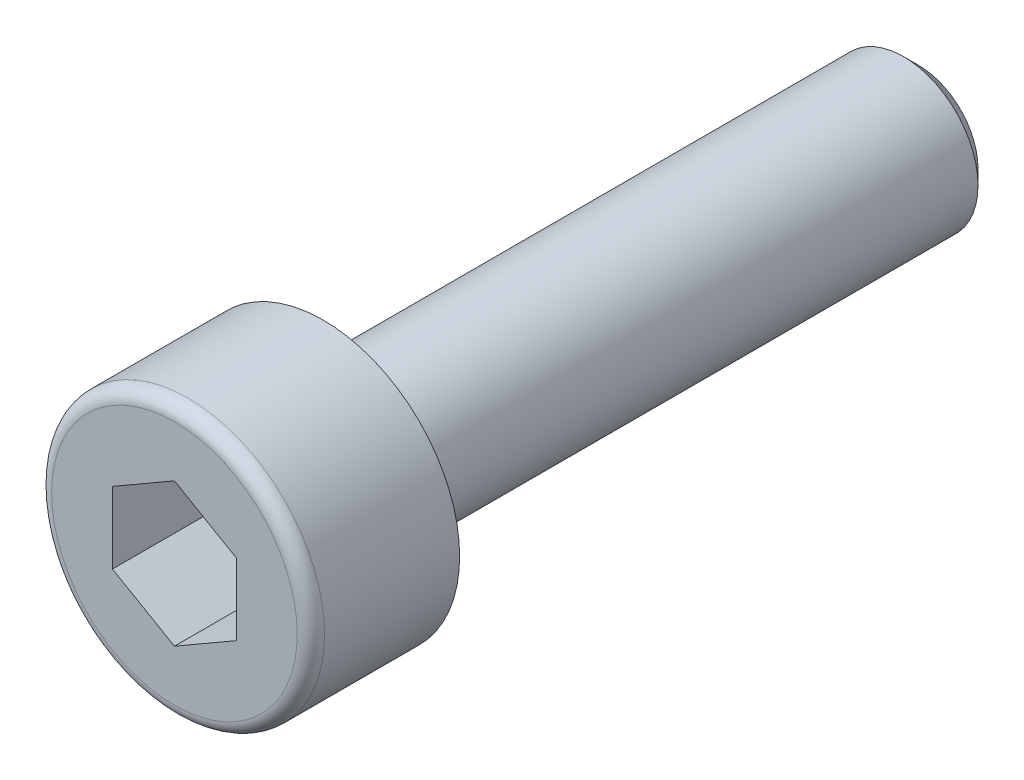
ISO-10303-21;
HEADER;
FILE_DESCRIPTION(('STEP AP214'),'2;1');
FILE_NAME('part.step','',(''),(''),'','','');
FILE_SCHEMA(('AUTOMOTIVE_DESIGN { 1 0 10303 214 1 1 1 1 }'));
ENDSEC;
DATA;
#1=APPLICATION_CONTEXT('core data for automotive mechanical design processes');
#2=APPLICATION_PROTOCOL_DEFINITION('international standard','automotive_design',2000,#1);
#3=PRODUCT_CONTEXT('',#1,'mechanical');
#4=PRODUCT('Part','Part','',(#3));
#5=PRODUCT_RELATED_PRODUCT_CATEGORY('part','',(#4));
#6=PRODUCT_DEFINITION_FORMATION('','',#4);
#7=PRODUCT_DEFINITION_CONTEXT('part definition',#1,'design');
#8=PRODUCT_DEFINITION('design','',#6,#7);
#9=PRODUCT_DEFINITION_SHAPE('','',#8);
#10=(LENGTH_UNIT() NAMED_UNIT(*) SI_UNIT(.MILLI.,.METRE.));
#11=(NAMED_UNIT(*) PLANE_ANGLE_UNIT() SI_UNIT($,.RADIAN.));
#12=(NAMED_UNIT(*) SI_UNIT($,.STERADIAN.) SOLID_ANGLE_UNIT());
#13=UNCERTAINTY_MEASURE_WITH_UNIT(LENGTH_MEASURE(1.E-05),#10,'distance_accuracy_value','');
#14=(GEOMETRIC_REPRESENTATION_CONTEXT(3) GLOBAL_UNCERTAINTY_ASSIGNED_CONTEXT((#13)) GLOBAL_UNIT_ASSIGNED_CONTEXT((#10,
#11,#12)) REPRESENTATION_CONTEXT('',''));
#15=CARTESIAN_POINT('',(0.,0.,0.));
#16=DIRECTION('',(0.,0.,1.));
#17=DIRECTION('',(1.,0.,0.));
#18=AXIS2_PLACEMENT_3D('',#15,#16,#17);
#19=CARTESIAN_POINT('',(0.,0.,3.));
#20=DIRECTION('',(0.,0.,-1.));
#21=DIRECTION('',(-1.,0.,0.));
#22=AXIS2_PLACEMENT_3D('',#19,#20,#21);
#23=PLANE('',#22);
#24=CARTESIAN_POINT('',(0.,0.,3.));
#25=DIRECTION('',(0.,0.,-1.));
#26=DIRECTION('',(-1.,0.,0.));
#27=AXIS2_PLACEMENT_3D('',#24,#25,#26);
#28=CIRCLE('',#27,2.475);
#29=CARTESIAN_POINT('',(-2.475,0.,3.));
#30=VERTEX_POINT('',#29);
#31=EDGE_CURVE('E177',#30,#30,#28,.F.);
#32=ORIENTED_EDGE('',*,*,#31,.T.);
#33=EDGE_LOOP('',(#32));
#34=FACE_BOUND('',#33,.T.);
#35=DIRECTION('',(-0.866025403784439,-0.5,0.));
#36=VECTOR('',#35,1.);
#37=CARTESIAN_POINT('',(0.,1.44337567297406,3.));
#38=LINE('',#37,#36);
#39=CARTESIAN_POINT('',(0.,1.44337567297406,3.));
#40=VERTEX_POINT('',#39);
#41=CARTESIAN_POINT('',(-1.25,0.721687836487032,3.));
#42=VERTEX_POINT('',#41);
#43=EDGE_CURVE('E141',#40,#42,#38,.T.);
#44=ORIENTED_EDGE('',*,*,#43,.F.);
#45=DIRECTION('',(-0.866025403784439,0.5,0.));
#46=VECTOR('',#45,1.);
#47=CARTESIAN_POINT('',(1.25,0.721687836487032,3.));
#48=LINE('',#47,#46);
#49=CARTESIAN_POINT('',(1.25,0.721687836487032,3.));
#50=VERTEX_POINT('',#49);
#51=EDGE_CURVE('E61',#50,#40,#48,.T.);
#52=ORIENTED_EDGE('',*,*,#51,.F.);
#53=DIRECTION('',(0.,1.,0.));
#54=VECTOR('',#53,1.);
#55=CARTESIAN_POINT('',(1.25,-0.721687836487032,3.));
#56=LINE('',#55,#54);
#57=CARTESIAN_POINT('',(1.25,-0.721687836487032,3.));
#58=VERTEX_POINT('',#57);
#59=EDGE_CURVE('E154',#58,#50,#56,.T.);
#60=ORIENTED_EDGE('',*,*,#59,.F.);
#61=DIRECTION('',(0.866025403784439,0.5,0.));
#62=VECTOR('',#61,1.);
#63=CARTESIAN_POINT('',(0.,-1.44337567297406,3.));
#64=LINE('',#63,#62);
#65=CARTESIAN_POINT('',(0.,-1.44337567297406,3.));
#66=VERTEX_POINT('',#65);
#67=EDGE_CURVE('E151',#66,#58,#64,.T.);
#68=ORIENTED_EDGE('',*,*,#67,.F.);
#69=DIRECTION('',(0.866025403784439,-0.5,0.));
#70=VECTOR('',#69,1.);
#71=CARTESIAN_POINT('',(-1.25,-0.721687836487033,3.));
#72=LINE('',#71,#70);
#73=CARTESIAN_POINT('',(-1.25,-0.721687836487033,3.));
#74=VERTEX_POINT('',#73);
#75=EDGE_CURVE('E109',#74,#66,#72,.T.);
#76=ORIENTED_EDGE('',*,*,#75,.F.);
#77=DIRECTION('',(0.,-1.,0.));
#78=VECTOR('',#77,1.);
#79=CARTESIAN_POINT('',(-1.25,0.721687836487032,3.));
#80=LINE('',#79,#78);
#81=EDGE_CURVE('E145',#42,#74,#80,.T.);
#82=ORIENTED_EDGE('',*,*,#81,.F.);
#83=EDGE_LOOP('',(#44,#52,#60,#68,#76,#82));
#84=FACE_BOUND('',#83,.T.);
#85=ADVANCED_FACE('F45',(#34,#84),#23,.F.);
#86=CARTESIAN_POINT('',(0.,0.,3.));
#87=DIRECTION('',(0.,0.,1.));
#88=DIRECTION('',(1.,0.,0.));
#89=AXIS2_PLACEMENT_3D('',#86,#87,#88);
#90=CYLINDRICAL_SURFACE('',#89,2.75);
#91=CARTESIAN_POINT('',(0.,0.,2.725));
#92=DIRECTION('',(0.,0.,-1.));
#93=DIRECTION('',(-1.,0.,0.));
#94=AXIS2_PLACEMENT_3D('',#91,#92,#93);
#95=CIRCLE('',#94,2.75);
#96=CARTESIAN_POINT('',(-2.75,0.,2.725));
#97=VERTEX_POINT('',#96);
#98=EDGE_CURVE('E181',#97,#97,#95,.T.);
#99=ORIENTED_EDGE('',*,*,#98,.T.);
#100=EDGE_LOOP('',(#99));
#101=FACE_BOUND('',#100,.T.);
#102=CARTESIAN_POINT('',(0.,0.,0.));
#103=DIRECTION('',(0.,0.,1.));
#104=DIRECTION('',(1.,0.,0.));
#105=AXIS2_PLACEMENT_3D('',#102,#103,#104);
#106=CIRCLE('',#105,2.75);
#107=CARTESIAN_POINT('',(2.75,0.,0.));
#108=VERTEX_POINT('',#107);
#109=EDGE_CURVE('E173',#108,#108,#106,.T.);
#110=ORIENTED_EDGE('',*,*,#109,.T.);
#111=EDGE_LOOP('',(#110));
#112=FACE_BOUND('',#111,.T.);
#113=ADVANCED_FACE('F201',(#101,#112),#90,.T.);
#114=CARTESIAN_POINT('',(0.,2.75,0.));
#115=DIRECTION('',(0.,0.,1.));
#116=DIRECTION('',(1.,0.,0.));
#117=AXIS2_PLACEMENT_3D('',#114,#115,#116);
#118=PLANE('',#117);
#119=ORIENTED_EDGE('',*,*,#109,.F.);
#120=EDGE_LOOP('',(#119));
#121=FACE_BOUND('',#120,.T.);
#122=CARTESIAN_POINT('',(0.,0.,0.));
#123=DIRECTION('',(0.,0.,1.));
#124=DIRECTION('',(1.,0.,0.));
#125=AXIS2_PLACEMENT_3D('',#122,#123,#124);
#126=CIRCLE('',#125,1.5);
#127=CARTESIAN_POINT('',(1.5,0.,0.));
#128=VERTEX_POINT('',#127);
#129=EDGE_CURVE('E160',#128,#128,#126,.T.);
#130=ORIENTED_EDGE('',*,*,#129,.T.);
#131=EDGE_LOOP('',(#130));
#132=FACE_BOUND('',#131,.T.);
#133=ADVANCED_FACE('F208',(#121,#132),#118,.F.);
#134=CARTESIAN_POINT('',(0.,0.,3.));
#135=DIRECTION('',(0.,0.,1.));
#136=DIRECTION('',(1.,0.,0.));
#137=AXIS2_PLACEMENT_3D('',#134,#135,#136);
#138=CYLINDRICAL_SURFACE('',#137,1.5);
#139=CARTESIAN_POINT('',(0.,0.,-11.7));
#140=DIRECTION('',(0.,0.,1.));
#141=DIRECTION('',(1.,0.,0.));
#142=AXIS2_PLACEMENT_3D('',#139,#140,#141);
#143=CIRCLE('',#142,1.5);
#144=CARTESIAN_POINT('',(1.5,0.,-11.7));
#145=VERTEX_POINT('',#144);
#146=EDGE_CURVE('E54',#145,#145,#143,.T.);
#147=ORIENTED_EDGE('',*,*,#146,.T.);
#148=EDGE_LOOP('',(#147));
#149=FACE_BOUND('',#148,.T.);
#150=ORIENTED_EDGE('',*,*,#129,.F.);
#151=EDGE_LOOP('',(#150));
#152=FACE_BOUND('',#151,.T.);
#153=ADVANCED_FACE('F188',(#149,#152),#138,.T.);
#154=CARTESIAN_POINT('',(0.,1.5,-12.));
#155=DIRECTION('',(0.,0.,1.));
#156=DIRECTION('',(1.,0.,0.));
#157=AXIS2_PLACEMENT_3D('',#154,#155,#156);
#158=PLANE('',#157);
#159=CARTESIAN_POINT('',(0.,0.,-12.));
#160=DIRECTION('',(0.,0.,1.));
#161=DIRECTION('',(1.,0.,0.));
#162=AXIS2_PLACEMENT_3D('',#159,#160,#161);
#163=CIRCLE('',#162,1.2);
#164=CARTESIAN_POINT('',(1.2,0.,-12.));
#165=VERTEX_POINT('',#164);
#166=EDGE_CURVE('E11',#165,#165,#163,.F.);
#167=ORIENTED_EDGE('',*,*,#166,.T.);
#168=EDGE_LOOP('',(#167));
#169=FACE_BOUND('',#168,.T.);
#170=ADVANCED_FACE('F218',(#169),#158,.F.);
#171=CARTESIAN_POINT('',(1.25,0.721687836487032,1.075));
#172=DIRECTION('',(0.5,0.866025403784439,0.));
#173=DIRECTION('',(-0.866025403784439,0.5,0.));
#174=AXIS2_PLACEMENT_3D('',#171,#172,#173);
#175=PLANE('',#174);
#176=ORIENTED_EDGE('',*,*,#51,.T.);
#177=DIRECTION('',(0.,0.,1.));
#178=VECTOR('',#177,1.);
#179=CARTESIAN_POINT('',(0.,1.44337567297406,1.075));
#180=LINE('',#179,#178);
#181=CARTESIAN_POINT('',(0.,1.44337567297406,1.075));
#182=VERTEX_POINT('',#181);
#183=EDGE_CURVE('E91',#182,#40,#180,.T.);
#184=ORIENTED_EDGE('',*,*,#183,.F.);
#185=DIRECTION('',(-0.866025403784439,0.5,0.));
#186=VECTOR('',#185,1.);
#187=CARTESIAN_POINT('',(1.25,0.721687836487032,1.075));
#188=LINE('',#187,#186);
#189=CARTESIAN_POINT('',(1.25,0.721687836487032,1.075));
#190=VERTEX_POINT('',#189);
#191=EDGE_CURVE('E157',#190,#182,#188,.T.);
#192=ORIENTED_EDGE('',*,*,#191,.F.);
#193=DIRECTION('',(0.,0.,1.));
#194=VECTOR('',#193,1.);
#195=CARTESIAN_POINT('',(1.25,0.721687836487032,1.075));
#196=LINE('',#195,#194);
#197=EDGE_CURVE('E69',#190,#50,#196,.T.);
#198=ORIENTED_EDGE('',*,*,#197,.T.);
#199=EDGE_LOOP('',(#176,#184,#192,#198));
#200=FACE_BOUND('',#199,.T.);
#201=ADVANCED_FACE('F220',(#200),#175,.F.);
#202=CARTESIAN_POINT('',(1.25,-0.721687836487032,1.075));
#203=DIRECTION('',(1.,0.,0.));
#204=DIRECTION('',(0.,0.,-1.));
#205=AXIS2_PLACEMENT_3D('',#202,#203,#204);
#206=PLANE('',#205);
#207=ORIENTED_EDGE('',*,*,#59,.T.);
#208=ORIENTED_EDGE('',*,*,#197,.F.);
#209=DIRECTION('',(0.,1.,0.));
#210=VECTOR('',#209,1.);
#211=CARTESIAN_POINT('',(1.25,-0.721687836487032,1.075));
#212=LINE('',#211,#210);
#213=CARTESIAN_POINT('',(1.25,-0.721687836487032,1.075));
#214=VERTEX_POINT('',#213);
#215=EDGE_CURVE('E123',#214,#190,#212,.T.);
#216=ORIENTED_EDGE('',*,*,#215,.F.);
#217=DIRECTION('',(0.,0.,1.));
#218=VECTOR('',#217,1.);
#219=CARTESIAN_POINT('',(1.25,-0.721687836487032,1.075));
#220=LINE('',#219,#218);
#221=EDGE_CURVE('E114',#214,#58,#220,.T.);
#222=ORIENTED_EDGE('',*,*,#221,.T.);
#223=EDGE_LOOP('',(#207,#208,#216,#222));
#224=FACE_BOUND('',#223,.T.);
#225=ADVANCED_FACE('F224',(#224),#206,.F.);
#226=CARTESIAN_POINT('',(0.,-1.44337567297406,1.075));
#227=DIRECTION('',(0.5,-0.866025403784439,0.));
#228=DIRECTION('',(0.866025403784439,0.5,0.));
#229=AXIS2_PLACEMENT_3D('',#226,#227,#228);
#230=PLANE('',#229);
#231=ORIENTED_EDGE('',*,*,#67,.T.);
#232=ORIENTED_EDGE('',*,*,#221,.F.);
#233=DIRECTION('',(0.866025403784439,0.5,0.));
#234=VECTOR('',#233,1.);
#235=CARTESIAN_POINT('',(0.,-1.44337567297406,1.075));
#236=LINE('',#235,#234);
#237=CARTESIAN_POINT('',(0.,-1.44337567297406,1.075));
#238=VERTEX_POINT('',#237);
#239=EDGE_CURVE('E118',#238,#214,#236,.T.);
#240=ORIENTED_EDGE('',*,*,#239,.F.);
#241=DIRECTION('',(0.,0.,1.));
#242=VECTOR('',#241,1.);
#243=CARTESIAN_POINT('',(0.,-1.44337567297406,1.075));
#244=LINE('',#243,#242);
#245=EDGE_CURVE('E102',#238,#66,#244,.T.);
#246=ORIENTED_EDGE('',*,*,#245,.T.);
#247=EDGE_LOOP('',(#231,#232,#240,#246));
#248=FACE_BOUND('',#247,.T.);
#249=ADVANCED_FACE('F119',(#248),#230,.F.);
#250=CARTESIAN_POINT('',(-1.25,-0.721687836487033,1.075));
#251=DIRECTION('',(-0.5,-0.866025403784439,0.));
#252=DIRECTION('',(0.866025403784439,-0.5,0.));
#253=AXIS2_PLACEMENT_3D('',#250,#251,#252);
#254=PLANE('',#253);
#255=ORIENTED_EDGE('',*,*,#75,.T.);
#256=ORIENTED_EDGE('',*,*,#245,.F.);
#257=DIRECTION('',(0.866025403784439,-0.5,0.));
#258=VECTOR('',#257,1.);
#259=CARTESIAN_POINT('',(-1.25,-0.721687836487033,1.075));
#260=LINE('',#259,#258);
#261=CARTESIAN_POINT('',(-1.25,-0.721687836487033,1.075));
#262=VERTEX_POINT('',#261);
#263=EDGE_CURVE('E106',#262,#238,#260,.T.);
#264=ORIENTED_EDGE('',*,*,#263,.F.);
#265=DIRECTION('',(0.,0.,1.));
#266=VECTOR('',#265,1.);
#267=CARTESIAN_POINT('',(-1.25,-0.721687836487033,1.075));
#268=LINE('',#267,#266);
#269=EDGE_CURVE('E115',#262,#74,#268,.T.);
#270=ORIENTED_EDGE('',*,*,#269,.T.);
#271=EDGE_LOOP('',(#255,#256,#264,#270));
#272=FACE_BOUND('',#271,.T.);
#273=ADVANCED_FACE('F104',(#272),#254,.F.);
#274=CARTESIAN_POINT('',(-1.25,0.721687836487032,1.075));
#275=DIRECTION('',(-1.,0.,0.));
#276=DIRECTION('',(0.,-1.,0.));
#277=AXIS2_PLACEMENT_3D('',#274,#275,#276);
#278=PLANE('',#277);
#279=ORIENTED_EDGE('',*,*,#81,.T.);
#280=ORIENTED_EDGE('',*,*,#269,.F.);
#281=DIRECTION('',(0.,-1.,0.));
#282=VECTOR('',#281,1.);
#283=CARTESIAN_POINT('',(-1.25,0.721687836487032,1.075));
#284=LINE('',#283,#282);
#285=CARTESIAN_POINT('',(-1.25,0.721687836487032,1.075));
#286=VERTEX_POINT('',#285);
#287=EDGE_CURVE('E129',#286,#262,#284,.T.);
#288=ORIENTED_EDGE('',*,*,#287,.F.);
#289=DIRECTION('',(0.,0.,1.));
#290=VECTOR('',#289,1.);
#291=CARTESIAN_POINT('',(-1.25,0.721687836487032,1.075));
#292=LINE('',#291,#290);
#293=EDGE_CURVE('E165',#286,#42,#292,.T.);
#294=ORIENTED_EDGE('',*,*,#293,.T.);
#295=EDGE_LOOP('',(#279,#280,#288,#294));
#296=FACE_BOUND('',#295,.T.);
#297=ADVANCED_FACE('F228',(#296),#278,.F.);
#298=CARTESIAN_POINT('',(0.,1.44337567297406,1.075));
#299=DIRECTION('',(-0.5,0.866025403784439,0.));
#300=DIRECTION('',(-0.866025403784439,-0.5,0.));
#301=AXIS2_PLACEMENT_3D('',#298,#299,#300);
#302=PLANE('',#301);
#303=ORIENTED_EDGE('',*,*,#43,.T.);
#304=ORIENTED_EDGE('',*,*,#293,.F.);
#305=DIRECTION('',(-0.866025403784439,-0.5,0.));
#306=VECTOR('',#305,1.);
#307=CARTESIAN_POINT('',(0.,1.44337567297406,1.075));
#308=LINE('',#307,#306);
#309=EDGE_CURVE('E133',#182,#286,#308,.T.);
#310=ORIENTED_EDGE('',*,*,#309,.F.);
#311=ORIENTED_EDGE('',*,*,#183,.T.);
#312=EDGE_LOOP('',(#303,#304,#310,#311));
#313=FACE_BOUND('',#312,.T.);
#314=ADVANCED_FACE('F225',(#313),#302,.F.);
#315=CARTESIAN_POINT('',(0.,1.44337567297406,1.075));
#316=DIRECTION('',(0.,0.,1.));
#317=DIRECTION('',(1.,0.,0.));
#318=AXIS2_PLACEMENT_3D('',#315,#316,#317);
#319=PLANE('',#318);
#320=ORIENTED_EDGE('',*,*,#191,.T.);
#321=ORIENTED_EDGE('',*,*,#309,.T.);
#322=ORIENTED_EDGE('',*,*,#287,.T.);
#323=ORIENTED_EDGE('',*,*,#263,.T.);
#324=ORIENTED_EDGE('',*,*,#239,.T.);
#325=ORIENTED_EDGE('',*,*,#215,.T.);
#326=EDGE_LOOP('',(#320,#321,#322,#323,#324,#325));
#327=FACE_BOUND('',#326,.T.);
#328=ADVANCED_FACE('F126',(#327),#319,.T.);
#329=CARTESIAN_POINT('',(0.,0.,2.725));
#330=DIRECTION('',(0.,0.,-1.));
#331=DIRECTION('',(-1.,0.,0.));
#332=AXIS2_PLACEMENT_3D('',#329,#330,#331);
#333=TOROIDAL_SURFACE('',#332,2.475,0.275);
#334=ORIENTED_EDGE('',*,*,#98,.F.);
#335=EDGE_LOOP('',(#334));
#336=FACE_BOUND('',#335,.T.);
#337=ORIENTED_EDGE('',*,*,#31,.F.);
#338=EDGE_LOOP('',(#337));
#339=FACE_BOUND('',#338,.T.);
#340=ADVANCED_FACE('F192',(#336,#339),#333,.T.);
#341=CARTESIAN_POINT('',(0.,0.,-11.7));
#342=DIRECTION('',(0.,0.,1.));
#343=DIRECTION('',(1.,0.,0.));
#344=AXIS2_PLACEMENT_3D('',#341,#342,#343);
#345=CONICAL_SURFACE('',#344,1.5,0.785398163397458);
#346=ORIENTED_EDGE('',*,*,#166,.F.);
#347=EDGE_LOOP('',(#346));
#348=FACE_BOUND('',#347,.T.);
#349=ORIENTED_EDGE('',*,*,#146,.F.);
#350=EDGE_LOOP('',(#349));
#351=FACE_BOUND('',#350,.T.);
#352=ADVANCED_FACE('F47',(#348,#351),#345,.T.);
#353=CLOSED_SHELL('',(#85,#113,#133,#153,#170,#201,#225,#249,#273,#297,#314,#328,#340,#352));
#354=MANIFOLD_SOLID_BREP('B2',#353);
#355=ADVANCED_BREP_SHAPE_REPRESENTATION('',(#18,#354),#14);
#356=SHAPE_DEFINITION_REPRESENTATION(#9,#355);
ENDSEC;
END-ISO-10303-21;
